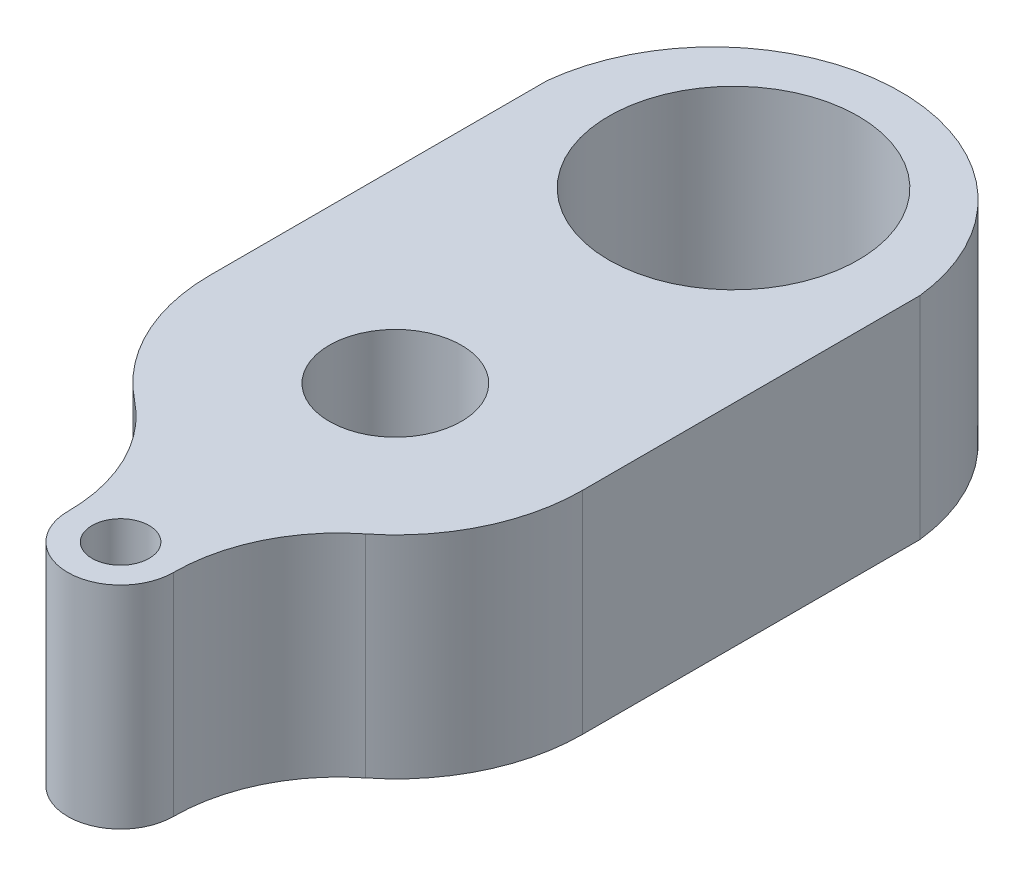
ISO-10303-21;
HEADER;
FILE_DESCRIPTION(('STEP AP214'),'2;1');
FILE_NAME('part.step','',(''),(''),'','','');
FILE_SCHEMA(('AUTOMOTIVE_DESIGN { 1 0 10303 214 1 1 1 1 }'));
ENDSEC;
DATA;
#1=APPLICATION_CONTEXT('core data for automotive mechanical design processes');
#2=APPLICATION_PROTOCOL_DEFINITION('international standard','automotive_design',2000,#1);
#3=PRODUCT_CONTEXT('',#1,'mechanical');
#4=PRODUCT('Part','Part','',(#3));
#5=PRODUCT_RELATED_PRODUCT_CATEGORY('part','',(#4));
#6=PRODUCT_DEFINITION_FORMATION('','',#4);
#7=PRODUCT_DEFINITION_CONTEXT('part definition',#1,'design');
#8=PRODUCT_DEFINITION('design','',#6,#7);
#9=PRODUCT_DEFINITION_SHAPE('','',#8);
#10=(LENGTH_UNIT() NAMED_UNIT(*) SI_UNIT(.MILLI.,.METRE.));
#11=(NAMED_UNIT(*) PLANE_ANGLE_UNIT() SI_UNIT($,.RADIAN.));
#12=(NAMED_UNIT(*) SI_UNIT($,.STERADIAN.) SOLID_ANGLE_UNIT());
#13=UNCERTAINTY_MEASURE_WITH_UNIT(LENGTH_MEASURE(1.E-05),#10,'distance_accuracy_value','');
#14=(GEOMETRIC_REPRESENTATION_CONTEXT(3) GLOBAL_UNCERTAINTY_ASSIGNED_CONTEXT((#13)) GLOBAL_UNIT_ASSIGNED_CONTEXT((#10,
#11,#12)) REPRESENTATION_CONTEXT('',''));
#15=CARTESIAN_POINT('',(0.,0.,0.));
#16=DIRECTION('',(0.,0.,1.));
#17=DIRECTION('',(1.,0.,0.));
#18=AXIS2_PLACEMENT_3D('',#15,#16,#17);
#19=CARTESIAN_POINT('',(0.,1.27,1.90433296484726));
#20=DIRECTION('',(0.,-1.,0.));
#21=DIRECTION('',(0.,0.,-1.));
#22=AXIS2_PLACEMENT_3D('',#19,#20,#21);
#23=CYLINDRICAL_SURFACE('',#22,1.11918749999999);
#24=CARTESIAN_POINT('',(0.,0.,1.90433296484726));
#25=DIRECTION('',(0.,1.,0.));
#26=DIRECTION('',(0.,0.,1.));
#27=AXIS2_PLACEMENT_3D('',#24,#25,#26);
#28=CIRCLE('',#27,1.11918749999999);
#29=CARTESIAN_POINT('',(-1.11918749999999,0.,1.90433296484726));
#30=VERTEX_POINT('',#29);
#31=CARTESIAN_POINT('',(-0.694232847744357,0.,2.78218341524812));
#32=VERTEX_POINT('',#31);
#33=EDGE_CURVE('E151',#30,#32,#28,.T.);
#34=ORIENTED_EDGE('',*,*,#33,.T.);
#35=DIRECTION('',(0.,-1.,0.));
#36=VECTOR('',#35,1.);
#37=CARTESIAN_POINT('',(-0.694232847744357,1.27,2.78218341524812));
#38=LINE('',#37,#36);
#39=CARTESIAN_POINT('',(-0.694232847744357,1.27,2.78218341524812));
#40=VERTEX_POINT('',#39);
#41=EDGE_CURVE('E12',#40,#32,#38,.T.);
#42=ORIENTED_EDGE('',*,*,#41,.F.);
#43=CARTESIAN_POINT('',(0.,1.27,1.90433296484726));
#44=DIRECTION('',(0.,1.,0.));
#45=DIRECTION('',(0.,0.,1.));
#46=AXIS2_PLACEMENT_3D('',#43,#44,#45);
#47=CIRCLE('',#46,1.11918749999999);
#48=CARTESIAN_POINT('',(-1.11918749999999,1.27,1.90433296484726));
#49=VERTEX_POINT('',#48);
#50=EDGE_CURVE('E198',#49,#40,#47,.T.);
#51=ORIENTED_EDGE('',*,*,#50,.F.);
#52=DIRECTION('',(0.,-1.,0.));
#53=VECTOR('',#52,1.);
#54=CARTESIAN_POINT('',(-1.11918749999999,1.27,1.90433296484726));
#55=LINE('',#54,#53);
#56=EDGE_CURVE('E144',#49,#30,#55,.T.);
#57=ORIENTED_EDGE('',*,*,#56,.T.);
#58=EDGE_LOOP('',(#34,#42,#51,#57));
#59=FACE_BOUND('',#58,.T.);
#60=ADVANCED_FACE('F35',(#59),#23,.T.);
#61=CARTESIAN_POINT('',(-1.3096875,1.27,3.5604196301425));
#62=DIRECTION('',(0.,-1.,0.));
#63=DIRECTION('',(0.,0.,-1.));
#64=AXIS2_PLACEMENT_3D('',#61,#62,#63);
#65=CYLINDRICAL_SURFACE('',#64,0.9921875);
#66=CARTESIAN_POINT('',(-1.3096875,0.,3.5604196301425));
#67=DIRECTION('',(0.,1.,0.));
#68=DIRECTION('',(0.,0.,1.));
#69=AXIS2_PLACEMENT_3D('',#66,#67,#68);
#70=CIRCLE('',#69,0.9921875);
#71=CARTESIAN_POINT('',(-0.317499999999998,0.,3.5604196301425));
#72=VERTEX_POINT('',#71);
#73=EDGE_CURVE('E154',#32,#72,#70,.F.);
#74=ORIENTED_EDGE('',*,*,#73,.T.);
#75=DIRECTION('',(0.,-1.,0.));
#76=VECTOR('',#75,1.);
#77=CARTESIAN_POINT('',(-0.317499999999998,1.27,3.5604196301425));
#78=LINE('',#77,#76);
#79=CARTESIAN_POINT('',(-0.317499999999998,1.27,3.5604196301425));
#80=VERTEX_POINT('',#79);
#81=EDGE_CURVE('E44',#80,#72,#78,.T.);
#82=ORIENTED_EDGE('',*,*,#81,.F.);
#83=CARTESIAN_POINT('',(-1.3096875,1.27,3.5604196301425));
#84=DIRECTION('',(0.,1.,0.));
#85=DIRECTION('',(0.,0.,1.));
#86=AXIS2_PLACEMENT_3D('',#83,#84,#85);
#87=CIRCLE('',#86,0.9921875);
#88=EDGE_CURVE('E94',#40,#80,#87,.F.);
#89=ORIENTED_EDGE('',*,*,#88,.F.);
#90=ORIENTED_EDGE('',*,*,#41,.T.);
#91=EDGE_LOOP('',(#74,#82,#89,#90));
#92=FACE_BOUND('',#91,.T.);
#93=ADVANCED_FACE('F228',(#92),#65,.F.);
#94=CARTESIAN_POINT('',(0.,1.27,3.5604196301425));
#95=DIRECTION('',(0.,-1.,0.));
#96=DIRECTION('',(0.,0.,-1.));
#97=AXIS2_PLACEMENT_3D('',#94,#95,#96);
#98=CYLINDRICAL_SURFACE('',#97,0.3175);
#99=CARTESIAN_POINT('',(0.,0.,3.5604196301425));
#100=DIRECTION('',(0.,1.,0.));
#101=DIRECTION('',(0.,0.,1.));
#102=AXIS2_PLACEMENT_3D('',#99,#100,#101);
#103=CIRCLE('',#102,0.3175);
#104=CARTESIAN_POINT('',(0.3175,0.,3.5604196301425));
#105=VERTEX_POINT('',#104);
#106=EDGE_CURVE('E156',#72,#105,#103,.T.);
#107=ORIENTED_EDGE('',*,*,#106,.T.);
#108=DIRECTION('',(0.,-1.,0.));
#109=VECTOR('',#108,1.);
#110=CARTESIAN_POINT('',(0.3175,1.27,3.5604196301425));
#111=LINE('',#110,#109);
#112=CARTESIAN_POINT('',(0.3175,1.27,3.5604196301425));
#113=VERTEX_POINT('',#112);
#114=EDGE_CURVE('E177',#113,#105,#111,.T.);
#115=ORIENTED_EDGE('',*,*,#114,.F.);
#116=CARTESIAN_POINT('',(0.,1.27,3.5604196301425));
#117=DIRECTION('',(0.,1.,0.));
#118=DIRECTION('',(0.,0.,1.));
#119=AXIS2_PLACEMENT_3D('',#116,#117,#118);
#120=CIRCLE('',#119,0.3175);
#121=EDGE_CURVE('E184',#80,#113,#120,.T.);
#122=ORIENTED_EDGE('',*,*,#121,.F.);
#123=ORIENTED_EDGE('',*,*,#81,.T.);
#124=EDGE_LOOP('',(#107,#115,#122,#123));
#125=FACE_BOUND('',#124,.T.);
#126=ADVANCED_FACE('F182',(#125),#98,.T.);
#127=CARTESIAN_POINT('',(1.3096875,1.27,3.5604196301425));
#128=DIRECTION('',(0.,-1.,0.));
#129=DIRECTION('',(0.,0.,-1.));
#130=AXIS2_PLACEMENT_3D('',#127,#128,#129);
#131=CYLINDRICAL_SURFACE('',#130,0.9921875);
#132=CARTESIAN_POINT('',(1.3096875,0.,3.5604196301425));
#133=DIRECTION('',(0.,1.,0.));
#134=DIRECTION('',(0.,0.,1.));
#135=AXIS2_PLACEMENT_3D('',#132,#133,#134);
#136=CIRCLE('',#135,0.9921875);
#137=CARTESIAN_POINT('',(0.694232847744357,0.,2.78218341524812));
#138=VERTEX_POINT('',#137);
#139=EDGE_CURVE('E159',#138,#105,#136,.T.);
#140=ORIENTED_EDGE('',*,*,#139,.F.);
#141=DIRECTION('',(0.,-1.,0.));
#142=VECTOR('',#141,1.);
#143=CARTESIAN_POINT('',(0.694232847744357,1.27,2.78218341524812));
#144=LINE('',#143,#142);
#145=CARTESIAN_POINT('',(0.694232847744357,1.27,2.78218341524812));
#146=VERTEX_POINT('',#145);
#147=EDGE_CURVE('E175',#146,#138,#144,.T.);
#148=ORIENTED_EDGE('',*,*,#147,.F.);
#149=CARTESIAN_POINT('',(1.3096875,1.27,3.5604196301425));
#150=DIRECTION('',(0.,1.,0.));
#151=DIRECTION('',(0.,0.,1.));
#152=AXIS2_PLACEMENT_3D('',#149,#150,#151);
#153=CIRCLE('',#152,0.9921875);
#154=EDGE_CURVE('E129',#146,#113,#153,.T.);
#155=ORIENTED_EDGE('',*,*,#154,.T.);
#156=ORIENTED_EDGE('',*,*,#114,.T.);
#157=EDGE_LOOP('',(#140,#148,#155,#156));
#158=FACE_BOUND('',#157,.T.);
#159=ADVANCED_FACE('F192',(#158),#131,.F.);
#160=CARTESIAN_POINT('',(0.,1.27,1.90433296484726));
#161=DIRECTION('',(0.,-1.,0.));
#162=DIRECTION('',(0.,0.,-1.));
#163=AXIS2_PLACEMENT_3D('',#160,#161,#162);
#164=CYLINDRICAL_SURFACE('',#163,1.11918749999999);
#165=CARTESIAN_POINT('',(0.,0.,1.90433296484726));
#166=DIRECTION('',(0.,1.,0.));
#167=DIRECTION('',(0.,0.,1.));
#168=AXIS2_PLACEMENT_3D('',#165,#166,#167);
#169=CIRCLE('',#168,1.11918749999999);
#170=CARTESIAN_POINT('',(1.11918749999999,0.,1.90433296484726));
#171=VERTEX_POINT('',#170);
#172=EDGE_CURVE('E162',#171,#138,#169,.F.);
#173=ORIENTED_EDGE('',*,*,#172,.F.);
#174=DIRECTION('',(0.,-1.,0.));
#175=VECTOR('',#174,1.);
#176=CARTESIAN_POINT('',(1.11918749999999,1.27,1.90433296484726));
#177=LINE('',#176,#175);
#178=CARTESIAN_POINT('',(1.11918749999999,1.27,1.90433296484726));
#179=VERTEX_POINT('',#178);
#180=EDGE_CURVE('E116',#179,#171,#177,.T.);
#181=ORIENTED_EDGE('',*,*,#180,.F.);
#182=CARTESIAN_POINT('',(0.,1.27,1.90433296484726));
#183=DIRECTION('',(0.,1.,0.));
#184=DIRECTION('',(0.,0.,1.));
#185=AXIS2_PLACEMENT_3D('',#182,#183,#184);
#186=CIRCLE('',#185,1.11918749999999);
#187=EDGE_CURVE('E127',#179,#146,#186,.F.);
#188=ORIENTED_EDGE('',*,*,#187,.T.);
#189=ORIENTED_EDGE('',*,*,#147,.T.);
#190=EDGE_LOOP('',(#173,#181,#188,#189));
#191=FACE_BOUND('',#190,.T.);
#192=ADVANCED_FACE('F240',(#191),#164,.T.);
#193=CARTESIAN_POINT('',(1.11918749999999,1.27,0.));
#194=DIRECTION('',(1.,0.,0.));
#195=DIRECTION('',(0.,0.,-1.));
#196=AXIS2_PLACEMENT_3D('',#193,#194,#195);
#197=PLANE('',#196);
#198=DIRECTION('',(0.,0.,1.));
#199=VECTOR('',#198,1.);
#200=CARTESIAN_POINT('',(1.11918749999999,0.,0.));
#201=LINE('',#200,#199);
#202=CARTESIAN_POINT('',(1.11918749999999,0.,-0.122580369857497));
#203=VERTEX_POINT('',#202);
#204=EDGE_CURVE('E115',#203,#171,#201,.T.);
#205=ORIENTED_EDGE('',*,*,#204,.F.);
#206=DIRECTION('',(0.,-1.,0.));
#207=VECTOR('',#206,1.);
#208=CARTESIAN_POINT('',(1.11918749999999,1.27,-0.122580369857497));
#209=LINE('',#208,#207);
#210=CARTESIAN_POINT('',(1.11918749999999,1.27,-0.122580369857497));
#211=VERTEX_POINT('',#210);
#212=EDGE_CURVE('E109',#211,#203,#209,.T.);
#213=ORIENTED_EDGE('',*,*,#212,.F.);
#214=DIRECTION('',(0.,0.,1.));
#215=VECTOR('',#214,1.);
#216=CARTESIAN_POINT('',(1.11918749999999,1.27,0.));
#217=LINE('',#216,#215);
#218=EDGE_CURVE('E113',#211,#179,#217,.T.);
#219=ORIENTED_EDGE('',*,*,#218,.T.);
#220=ORIENTED_EDGE('',*,*,#180,.T.);
#221=EDGE_LOOP('',(#205,#213,#219,#220));
#222=FACE_BOUND('',#221,.T.);
#223=ADVANCED_FACE('F111',(#222),#197,.T.);
#224=CARTESIAN_POINT('',(0.,1.27,0.));
#225=DIRECTION('',(0.,-1.,0.));
#226=DIRECTION('',(0.,0.,-1.));
#227=AXIS2_PLACEMENT_3D('',#224,#225,#226);
#228=CYLINDRICAL_SURFACE('',#227,1.12588036985757);
#229=CARTESIAN_POINT('',(0.,0.,0.));
#230=DIRECTION('',(0.,1.,0.));
#231=DIRECTION('',(0.,0.,1.));
#232=AXIS2_PLACEMENT_3D('',#229,#230,#231);
#233=CIRCLE('',#232,1.12588036985757);
#234=CARTESIAN_POINT('',(-1.11918749999999,0.,-0.122580369857497));
#235=VERTEX_POINT('',#234);
#236=EDGE_CURVE('E80',#203,#235,#233,.T.);
#237=ORIENTED_EDGE('',*,*,#236,.T.);
#238=DIRECTION('',(0.,-1.,0.));
#239=VECTOR('',#238,1.);
#240=CARTESIAN_POINT('',(-1.11918749999999,1.27,-0.122580369857497));
#241=LINE('',#240,#239);
#242=CARTESIAN_POINT('',(-1.11918749999999,1.27,-0.122580369857497));
#243=VERTEX_POINT('',#242);
#244=EDGE_CURVE('E117',#243,#235,#241,.T.);
#245=ORIENTED_EDGE('',*,*,#244,.F.);
#246=CARTESIAN_POINT('',(0.,1.27,0.));
#247=DIRECTION('',(0.,1.,0.));
#248=DIRECTION('',(0.,0.,1.));
#249=AXIS2_PLACEMENT_3D('',#246,#247,#248);
#250=CIRCLE('',#249,1.12588036985757);
#251=EDGE_CURVE('E119',#211,#243,#250,.T.);
#252=ORIENTED_EDGE('',*,*,#251,.F.);
#253=ORIENTED_EDGE('',*,*,#212,.T.);
#254=EDGE_LOOP('',(#237,#245,#252,#253));
#255=FACE_BOUND('',#254,.T.);
#256=ADVANCED_FACE('F120',(#255),#228,.T.);
#257=CARTESIAN_POINT('',(-1.11918749999999,1.27,0.));
#258=DIRECTION('',(1.,0.,0.));
#259=DIRECTION('',(0.,0.,-1.));
#260=AXIS2_PLACEMENT_3D('',#257,#258,#259);
#261=PLANE('',#260);
#262=DIRECTION('',(0.,0.,1.));
#263=VECTOR('',#262,1.);
#264=CARTESIAN_POINT('',(-1.11918749999999,0.,0.));
#265=LINE('',#264,#263);
#266=EDGE_CURVE('E86',#235,#30,#265,.T.);
#267=ORIENTED_EDGE('',*,*,#266,.T.);
#268=ORIENTED_EDGE('',*,*,#56,.F.);
#269=DIRECTION('',(0.,0.,1.));
#270=VECTOR('',#269,1.);
#271=CARTESIAN_POINT('',(-1.11918749999999,1.27,0.));
#272=LINE('',#271,#270);
#273=EDGE_CURVE('E52',#243,#49,#272,.T.);
#274=ORIENTED_EDGE('',*,*,#273,.F.);
#275=ORIENTED_EDGE('',*,*,#244,.T.);
#276=EDGE_LOOP('',(#267,#268,#274,#275));
#277=FACE_BOUND('',#276,.T.);
#278=ADVANCED_FACE('F218',(#277),#261,.F.);
#279=CARTESIAN_POINT('',(0.,1.27,-0.12258036985756));
#280=DIRECTION('',(0.,-1.,0.));
#281=DIRECTION('',(0.,0.,-1.));
#282=AXIS2_PLACEMENT_3D('',#279,#280,#281);
#283=CYLINDRICAL_SURFACE('',#282,0.749300000000012);
#284=CARTESIAN_POINT('',(0.,1.27,-0.12258036985756));
#285=DIRECTION('',(0.,1.,0.));
#286=DIRECTION('',(0.,0.,1.));
#287=AXIS2_PLACEMENT_3D('',#284,#285,#286);
#288=CIRCLE('',#287,0.749300000000012);
#289=CARTESIAN_POINT('',(0.,1.27,0.626719630142452));
#290=VERTEX_POINT('',#289);
#291=EDGE_CURVE('E201',#290,#290,#288,.T.);
#292=ORIENTED_EDGE('',*,*,#291,.T.);
#293=EDGE_LOOP('',(#292));
#294=FACE_BOUND('',#293,.T.);
#295=CARTESIAN_POINT('',(0.,0.,-0.12258036985756));
#296=DIRECTION('',(0.,1.,0.));
#297=DIRECTION('',(0.,0.,1.));
#298=AXIS2_PLACEMENT_3D('',#295,#296,#297);
#299=CIRCLE('',#298,0.749300000000012);
#300=CARTESIAN_POINT('',(0.,0.,0.626719630142452));
#301=VERTEX_POINT('',#300);
#302=EDGE_CURVE('E148',#301,#301,#299,.T.);
#303=ORIENTED_EDGE('',*,*,#302,.F.);
#304=EDGE_LOOP('',(#303));
#305=FACE_BOUND('',#304,.T.);
#306=ADVANCED_FACE('F215',(#294,#305),#283,.F.);
#307=CARTESIAN_POINT('',(0.,1.27,1.9094196301425));
#308=DIRECTION('',(0.,-1.,0.));
#309=DIRECTION('',(0.,0.,-1.));
#310=AXIS2_PLACEMENT_3D('',#307,#308,#309);
#311=CYLINDRICAL_SURFACE('',#310,0.396875);
#312=CARTESIAN_POINT('',(0.,1.27,1.9094196301425));
#313=DIRECTION('',(0.,1.,0.));
#314=DIRECTION('',(0.,0.,1.));
#315=AXIS2_PLACEMENT_3D('',#312,#313,#314);
#316=CIRCLE('',#315,0.396875);
#317=CARTESIAN_POINT('',(0.,1.27,2.3062946301425));
#318=VERTEX_POINT('',#317);
#319=EDGE_CURVE('E171',#318,#318,#316,.T.);
#320=ORIENTED_EDGE('',*,*,#319,.T.);
#321=EDGE_LOOP('',(#320));
#322=FACE_BOUND('',#321,.T.);
#323=CARTESIAN_POINT('',(0.,0.,1.9094196301425));
#324=DIRECTION('',(0.,1.,0.));
#325=DIRECTION('',(0.,0.,1.));
#326=AXIS2_PLACEMENT_3D('',#323,#324,#325);
#327=CIRCLE('',#326,0.396875);
#328=CARTESIAN_POINT('',(0.,0.,2.3062946301425));
#329=VERTEX_POINT('',#328);
#330=EDGE_CURVE('E145',#329,#329,#327,.T.);
#331=ORIENTED_EDGE('',*,*,#330,.F.);
#332=EDGE_LOOP('',(#331));
#333=FACE_BOUND('',#332,.T.);
#334=ADVANCED_FACE('F37',(#322,#333),#311,.F.);
#335=CARTESIAN_POINT('',(0.,1.27,3.5604196301425));
#336=DIRECTION('',(0.,-1.,0.));
#337=DIRECTION('',(0.,0.,-1.));
#338=AXIS2_PLACEMENT_3D('',#335,#336,#337);
#339=CYLINDRICAL_SURFACE('',#338,0.17145);
#340=CARTESIAN_POINT('',(0.,1.27,3.5604196301425));
#341=DIRECTION('',(0.,1.,0.));
#342=DIRECTION('',(0.,0.,1.));
#343=AXIS2_PLACEMENT_3D('',#340,#341,#342);
#344=CIRCLE('',#343,0.17145);
#345=CARTESIAN_POINT('',(0.,1.27,3.7318696301425));
#346=VERTEX_POINT('',#345);
#347=EDGE_CURVE('E141',#346,#346,#344,.T.);
#348=ORIENTED_EDGE('',*,*,#347,.T.);
#349=EDGE_LOOP('',(#348));
#350=FACE_BOUND('',#349,.T.);
#351=CARTESIAN_POINT('',(0.,0.,3.5604196301425));
#352=DIRECTION('',(0.,1.,0.));
#353=DIRECTION('',(0.,0.,1.));
#354=AXIS2_PLACEMENT_3D('',#351,#352,#353);
#355=CIRCLE('',#354,0.17145);
#356=CARTESIAN_POINT('',(0.,0.,3.7318696301425));
#357=VERTEX_POINT('',#356);
#358=EDGE_CURVE('E168',#357,#357,#355,.T.);
#359=ORIENTED_EDGE('',*,*,#358,.F.);
#360=EDGE_LOOP('',(#359));
#361=FACE_BOUND('',#360,.T.);
#362=ADVANCED_FACE('F211',(#350,#361),#339,.F.);
#363=CARTESIAN_POINT('',(0.,1.27,0.));
#364=DIRECTION('',(0.,1.,0.));
#365=DIRECTION('',(0.,0.,1.));
#366=AXIS2_PLACEMENT_3D('',#363,#364,#365);
#367=PLANE('',#366);
#368=ORIENTED_EDGE('',*,*,#319,.F.);
#369=EDGE_LOOP('',(#368));
#370=FACE_BOUND('',#369,.T.);
#371=ORIENTED_EDGE('',*,*,#291,.F.);
#372=EDGE_LOOP('',(#371));
#373=FACE_BOUND('',#372,.T.);
#374=ORIENTED_EDGE('',*,*,#50,.T.);
#375=ORIENTED_EDGE('',*,*,#88,.T.);
#376=ORIENTED_EDGE('',*,*,#121,.T.);
#377=ORIENTED_EDGE('',*,*,#154,.F.);
#378=ORIENTED_EDGE('',*,*,#187,.F.);
#379=ORIENTED_EDGE('',*,*,#218,.F.);
#380=ORIENTED_EDGE('',*,*,#251,.T.);
#381=ORIENTED_EDGE('',*,*,#273,.T.);
#382=EDGE_LOOP('',(#374,#375,#376,#377,#378,#379,#380,#381));
#383=FACE_BOUND('',#382,.T.);
#384=ORIENTED_EDGE('',*,*,#347,.F.);
#385=EDGE_LOOP('',(#384));
#386=FACE_BOUND('',#385,.T.);
#387=ADVANCED_FACE('F123',(#370,#373,#383,#386),#367,.T.);
#388=CARTESIAN_POINT('',(0.,0.,0.));
#389=DIRECTION('',(0.,1.,0.));
#390=DIRECTION('',(0.,0.,1.));
#391=AXIS2_PLACEMENT_3D('',#388,#389,#390);
#392=PLANE('',#391);
#393=ORIENTED_EDGE('',*,*,#330,.T.);
#394=EDGE_LOOP('',(#393));
#395=FACE_BOUND('',#394,.T.);
#396=ORIENTED_EDGE('',*,*,#302,.T.);
#397=EDGE_LOOP('',(#396));
#398=FACE_BOUND('',#397,.T.);
#399=ORIENTED_EDGE('',*,*,#33,.F.);
#400=ORIENTED_EDGE('',*,*,#266,.F.);
#401=ORIENTED_EDGE('',*,*,#236,.F.);
#402=ORIENTED_EDGE('',*,*,#204,.T.);
#403=ORIENTED_EDGE('',*,*,#172,.T.);
#404=ORIENTED_EDGE('',*,*,#139,.T.);
#405=ORIENTED_EDGE('',*,*,#106,.F.);
#406=ORIENTED_EDGE('',*,*,#73,.F.);
#407=EDGE_LOOP('',(#399,#400,#401,#402,#403,#404,#405,#406));
#408=FACE_BOUND('',#407,.T.);
#409=ORIENTED_EDGE('',*,*,#358,.T.);
#410=EDGE_LOOP('',(#409));
#411=FACE_BOUND('',#410,.T.);
#412=ADVANCED_FACE('F187',(#395,#398,#408,#411),#392,.F.);
#413=CLOSED_SHELL('',(#60,#93,#126,#159,#192,#223,#256,#278,#306,#334,#362,#387,#412));
#414=MANIFOLD_SOLID_BREP('B2',#413);
#415=ADVANCED_BREP_SHAPE_REPRESENTATION('',(#18,#414),#14);
#416=SHAPE_DEFINITION_REPRESENTATION(#9,#415);
ENDSEC;
END-ISO-10303-21;
